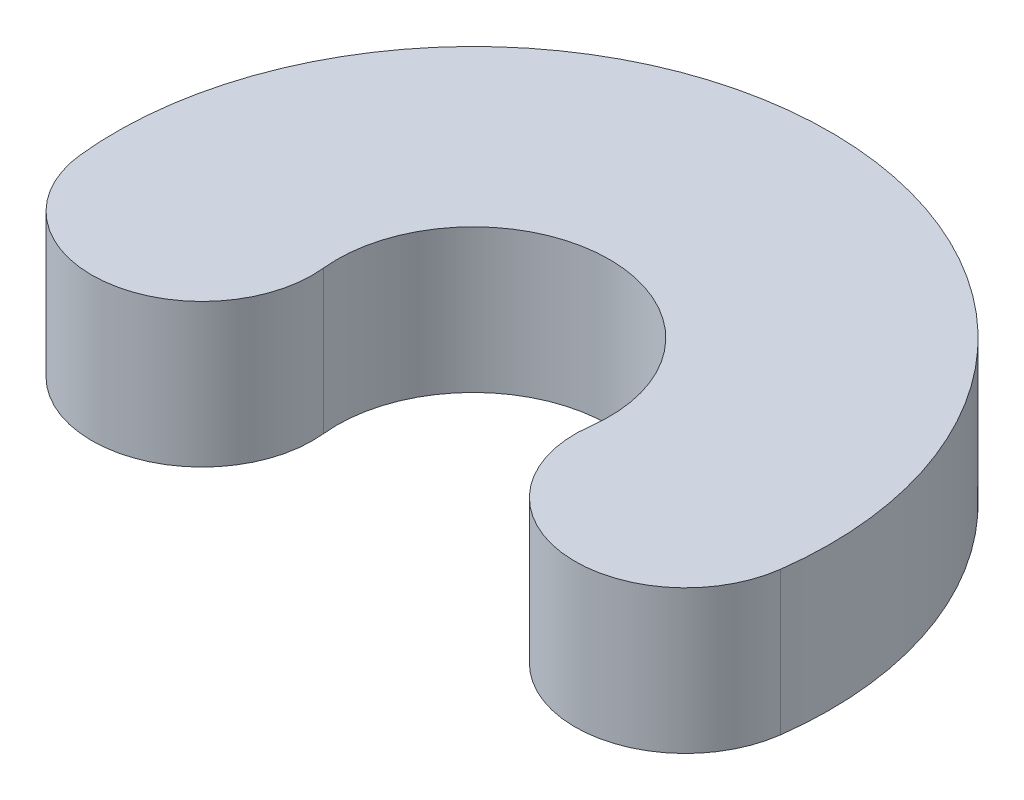
ISO-10303-21;
HEADER;
FILE_DESCRIPTION(('STEP AP214'),'2;1');
FILE_NAME('part.step','',(''),(''),'','','');
FILE_SCHEMA(('AUTOMOTIVE_DESIGN { 1 0 10303 214 1 1 1 1 }'));
ENDSEC;
DATA;
#1=APPLICATION_CONTEXT('core data for automotive mechanical design processes');
#2=APPLICATION_PROTOCOL_DEFINITION('international standard','automotive_design',2000,#1);
#3=PRODUCT_CONTEXT('',#1,'mechanical');
#4=PRODUCT('Part','Part','',(#3));
#5=PRODUCT_RELATED_PRODUCT_CATEGORY('part','',(#4));
#6=PRODUCT_DEFINITION_FORMATION('','',#4);
#7=PRODUCT_DEFINITION_CONTEXT('part definition',#1,'design');
#8=PRODUCT_DEFINITION('design','',#6,#7);
#9=PRODUCT_DEFINITION_SHAPE('','',#8);
#10=(LENGTH_UNIT() NAMED_UNIT(*) SI_UNIT(.MILLI.,.METRE.));
#11=(NAMED_UNIT(*) PLANE_ANGLE_UNIT() SI_UNIT($,.RADIAN.));
#12=(NAMED_UNIT(*) SI_UNIT($,.STERADIAN.) SOLID_ANGLE_UNIT());
#13=UNCERTAINTY_MEASURE_WITH_UNIT(LENGTH_MEASURE(1.E-05),#10,'distance_accuracy_value','');
#14=(GEOMETRIC_REPRESENTATION_CONTEXT(3) GLOBAL_UNCERTAINTY_ASSIGNED_CONTEXT((#13)) GLOBAL_UNIT_ASSIGNED_CONTEXT((#10,
#11,#12)) REPRESENTATION_CONTEXT('',''));
#15=CARTESIAN_POINT('',(0.,0.,0.));
#16=DIRECTION('',(0.,0.,1.));
#17=DIRECTION('',(1.,0.,0.));
#18=AXIS2_PLACEMENT_3D('',#15,#16,#17);
#19=CARTESIAN_POINT('',(56.2372597438321,33.,7.40677828719636));
#20=DIRECTION('',(0.,-1.,0.));
#21=DIRECTION('',(0.,0.,-1.));
#22=AXIS2_PLACEMENT_3D('',#19,#20,#21);
#23=CYLINDRICAL_SURFACE('',#22,25.4);
#24=CARTESIAN_POINT('',(56.2372597438321,0.,7.40677828719636));
#25=DIRECTION('',(0.,1.,0.));
#26=DIRECTION('',(0.,0.,1.));
#27=AXIS2_PLACEMENT_3D('',#24,#25,#26);
#28=CIRCLE('',#27,25.4);
#29=CARTESIAN_POINT('',(31.0547342945488,0.,4.09009138665836));
#30=VERTEX_POINT('',#29);
#31=CARTESIAN_POINT('',(81.4197851931153,0.,10.7234651877344));
#32=VERTEX_POINT('',#31);
#33=EDGE_CURVE('E143',#30,#32,#28,.T.);
#34=ORIENTED_EDGE('',*,*,#33,.T.);
#35=DIRECTION('',(0.,-1.,0.));
#36=VECTOR('',#35,1.);
#37=CARTESIAN_POINT('',(81.4197851931153,33.,10.7234651877344));
#38=LINE('',#37,#36);
#39=CARTESIAN_POINT('',(81.4197851931153,33.,10.7234651877344));
#40=VERTEX_POINT('',#39);
#41=EDGE_CURVE('E11',#40,#32,#38,.T.);
#42=ORIENTED_EDGE('',*,*,#41,.F.);
#43=CARTESIAN_POINT('',(56.2372597438321,33.,7.40677828719636));
#44=DIRECTION('',(0.,1.,0.));
#45=DIRECTION('',(0.,0.,1.));
#46=AXIS2_PLACEMENT_3D('',#43,#44,#45);
#47=CIRCLE('',#46,25.4);
#48=CARTESIAN_POINT('',(31.0547342945488,33.,4.09009138665836));
#49=VERTEX_POINT('',#48);
#50=EDGE_CURVE('E173',#49,#40,#47,.T.);
#51=ORIENTED_EDGE('',*,*,#50,.F.);
#52=DIRECTION('',(0.,-1.,0.));
#53=VECTOR('',#52,1.);
#54=CARTESIAN_POINT('',(31.0547342945488,33.,4.09009138665836));
#55=LINE('',#54,#53);
#56=EDGE_CURVE('E182',#49,#30,#55,.T.);
#57=ORIENTED_EDGE('',*,*,#56,.T.);
#58=EDGE_LOOP('',(#34,#42,#51,#57));
#59=FACE_BOUND('',#58,.T.);
#60=ADVANCED_FACE('F43',(#59),#23,.T.);
#61=CARTESIAN_POINT('',(0.,33.,0.));
#62=DIRECTION('',(0.,-1.,0.));
#63=DIRECTION('',(0.,0.,-1.));
#64=AXIS2_PLACEMENT_3D('',#61,#62,#63);
#65=CYLINDRICAL_SURFACE('',#64,82.1229208353283);
#66=CARTESIAN_POINT('',(0.,0.,0.));
#67=DIRECTION('',(0.,1.,0.));
#68=DIRECTION('',(0.,0.,1.));
#69=AXIS2_PLACEMENT_3D('',#66,#67,#68);
#70=CIRCLE('',#69,82.1229208353283);
#71=CARTESIAN_POINT('',(-81.6700361672202,0.,8.61274166398485));
#72=VERTEX_POINT('',#71);
#73=EDGE_CURVE('E149',#32,#72,#70,.T.);
#74=ORIENTED_EDGE('',*,*,#73,.T.);
#75=DIRECTION('',(0.,-1.,0.));
#76=VECTOR('',#75,1.);
#77=CARTESIAN_POINT('',(-81.6700361672202,33.,8.61274166398485));
#78=LINE('',#77,#76);
#79=CARTESIAN_POINT('',(-81.6700361672202,33.,8.61274166398485));
#80=VERTEX_POINT('',#79);
#81=EDGE_CURVE('E51',#80,#72,#78,.T.);
#82=ORIENTED_EDGE('',*,*,#81,.F.);
#83=CARTESIAN_POINT('',(0.,33.,0.));
#84=DIRECTION('',(0.,1.,0.));
#85=DIRECTION('',(0.,0.,1.));
#86=AXIS2_PLACEMENT_3D('',#83,#84,#85);
#87=CIRCLE('',#86,82.1229208353283);
#88=EDGE_CURVE('E95',#40,#80,#87,.T.);
#89=ORIENTED_EDGE('',*,*,#88,.F.);
#90=ORIENTED_EDGE('',*,*,#41,.T.);
#91=EDGE_LOOP('',(#74,#82,#89,#90));
#92=FACE_BOUND('',#91,.T.);
#93=ADVANCED_FACE('F217',(#92),#65,.T.);
#94=CARTESIAN_POINT('',(-56.4101099791711,33.,5.94888562915292));
#95=DIRECTION('',(0.,-1.,0.));
#96=DIRECTION('',(0.,0.,-1.));
#97=AXIS2_PLACEMENT_3D('',#94,#95,#96);
#98=CYLINDRICAL_SURFACE('',#97,25.4);
#99=CARTESIAN_POINT('',(-56.4101099791711,0.,5.94888562915292));
#100=DIRECTION('',(0.,1.,0.));
#101=DIRECTION('',(0.,0.,1.));
#102=AXIS2_PLACEMENT_3D('',#99,#100,#101);
#103=CIRCLE('',#102,25.4);
#104=CARTESIAN_POINT('',(-31.150183791122,0.,3.28502959432098));
#105=VERTEX_POINT('',#104);
#106=EDGE_CURVE('E186',#72,#105,#103,.T.);
#107=ORIENTED_EDGE('',*,*,#106,.T.);
#108=DIRECTION('',(0.,-1.,0.));
#109=VECTOR('',#108,1.);
#110=CARTESIAN_POINT('',(-31.150183791122,33.,3.28502959432098));
#111=LINE('',#110,#109);
#112=CARTESIAN_POINT('',(-31.150183791122,33.,3.28502959432098));
#113=VERTEX_POINT('',#112);
#114=EDGE_CURVE('E193',#113,#105,#111,.T.);
#115=ORIENTED_EDGE('',*,*,#114,.F.);
#116=CARTESIAN_POINT('',(-56.4101099791711,33.,5.94888562915292));
#117=DIRECTION('',(0.,1.,0.));
#118=DIRECTION('',(0.,0.,1.));
#119=AXIS2_PLACEMENT_3D('',#116,#117,#118);
#120=CIRCLE('',#119,25.4);
#121=EDGE_CURVE('E178',#80,#113,#120,.T.);
#122=ORIENTED_EDGE('',*,*,#121,.F.);
#123=ORIENTED_EDGE('',*,*,#81,.T.);
#124=EDGE_LOOP('',(#107,#115,#122,#123));
#125=FACE_BOUND('',#124,.T.);
#126=ADVANCED_FACE('F200',(#125),#98,.T.);
#127=CARTESIAN_POINT('',(0.,33.,0.));
#128=DIRECTION('',(0.,-1.,0.));
#129=DIRECTION('',(0.,0.,-1.));
#130=AXIS2_PLACEMENT_3D('',#127,#128,#129);
#131=CYLINDRICAL_SURFACE('',#130,31.3229208353283);
#132=CARTESIAN_POINT('',(0.,0.,0.));
#133=DIRECTION('',(0.,-1.,0.));
#134=DIRECTION('',(0.,0.,1.));
#135=AXIS2_PLACEMENT_3D('',#132,#133,#134);
#136=CIRCLE('',#135,31.3229208353283);
#137=EDGE_CURVE('E88',#105,#30,#136,.T.);
#138=ORIENTED_EDGE('',*,*,#137,.T.);
#139=ORIENTED_EDGE('',*,*,#56,.F.);
#140=CARTESIAN_POINT('',(0.,33.,0.));
#141=DIRECTION('',(0.,-1.,0.));
#142=DIRECTION('',(0.,0.,1.));
#143=AXIS2_PLACEMENT_3D('',#140,#141,#142);
#144=CIRCLE('',#143,31.3229208353283);
#145=EDGE_CURVE('E67',#113,#49,#144,.T.);
#146=ORIENTED_EDGE('',*,*,#145,.F.);
#147=ORIENTED_EDGE('',*,*,#114,.T.);
#148=EDGE_LOOP('',(#138,#139,#146,#147));
#149=FACE_BOUND('',#148,.T.);
#150=ADVANCED_FACE('F208',(#149),#131,.F.);
#151=CARTESIAN_POINT('',(28.118629871916,33.,3.70338914359818));
#152=DIRECTION('',(0.,1.,0.));
#153=DIRECTION('',(0.,0.,1.));
#154=AXIS2_PLACEMENT_3D('',#151,#152,#153);
#155=PLANE('',#154);
#156=ORIENTED_EDGE('',*,*,#50,.T.);
#157=ORIENTED_EDGE('',*,*,#88,.T.);
#158=ORIENTED_EDGE('',*,*,#121,.T.);
#159=ORIENTED_EDGE('',*,*,#145,.T.);
#160=EDGE_LOOP('',(#156,#157,#158,#159));
#161=FACE_BOUND('',#160,.T.);
#162=ADVANCED_FACE('F210',(#161),#155,.T.);
#163=CARTESIAN_POINT('',(28.118629871916,0.,3.70338914359818));
#164=DIRECTION('',(0.,1.,0.));
#165=DIRECTION('',(0.,0.,1.));
#166=AXIS2_PLACEMENT_3D('',#163,#164,#165);
#167=PLANE('',#166);
#168=CARTESIAN_POINT('',(0.,0.,0.));
#169=DIRECTION('',(0.,1.,0.));
#170=DIRECTION('',(0.,0.,1.));
#171=AXIS2_PLACEMENT_3D('',#168,#169,#170);
#172=CIRCLE('',#171,41.3229208353283);
#173=CARTESIAN_POINT('',(-41.0950366210626,0.,4.33379181275875));
#174=VERTEX_POINT('',#173);
#175=CARTESIAN_POINT('',(40.9691143926918,0.,5.39587363096467));
#176=VERTEX_POINT('',#175);
#177=EDGE_CURVE('E137',#174,#176,#172,.F.);
#178=ORIENTED_EDGE('',*,*,#177,.T.);
#179=CARTESIAN_POINT('',(56.2372597438321,0.,7.40677828719636));
#180=DIRECTION('',(0.,1.,0.));
#181=DIRECTION('',(0.,0.,1.));
#182=AXIS2_PLACEMENT_3D('',#179,#180,#181);
#183=CIRCLE('',#182,15.4);
#184=CARTESIAN_POINT('',(71.5054050949723,0.,9.41768294342808));
#185=VERTEX_POINT('',#184);
#186=EDGE_CURVE('E163',#176,#185,#183,.T.);
#187=ORIENTED_EDGE('',*,*,#186,.T.);
#188=CARTESIAN_POINT('',(0.,0.,0.));
#189=DIRECTION('',(0.,1.,0.));
#190=DIRECTION('',(0.,0.,1.));
#191=AXIS2_PLACEMENT_3D('',#188,#189,#190);
#192=CIRCLE('',#191,72.1229208353283);
#193=CARTESIAN_POINT('',(-71.7251833372796,0.,7.5639794455471));
#194=VERTEX_POINT('',#193);
#195=EDGE_CURVE('E141',#185,#194,#192,.T.);
#196=ORIENTED_EDGE('',*,*,#195,.T.);
#197=CARTESIAN_POINT('',(-56.4101099791711,0.,5.94888562915292));
#198=DIRECTION('',(0.,1.,0.));
#199=DIRECTION('',(0.,0.,1.));
#200=AXIS2_PLACEMENT_3D('',#197,#198,#199);
#201=CIRCLE('',#200,15.4);
#202=EDGE_CURVE('E58',#194,#174,#201,.T.);
#203=ORIENTED_EDGE('',*,*,#202,.T.);
#204=EDGE_LOOP('',(#178,#187,#196,#203));
#205=FACE_BOUND('',#204,.T.);
#206=ORIENTED_EDGE('',*,*,#33,.F.);
#207=ORIENTED_EDGE('',*,*,#137,.F.);
#208=ORIENTED_EDGE('',*,*,#106,.F.);
#209=ORIENTED_EDGE('',*,*,#73,.F.);
#210=EDGE_LOOP('',(#206,#207,#208,#209));
#211=FACE_BOUND('',#210,.T.);
#212=ADVANCED_FACE('F204',(#205,#211),#167,.F.);
#213=CARTESIAN_POINT('',(56.2372597438321,33.,7.40677828719636));
#214=DIRECTION('',(0.,-1.,0.));
#215=DIRECTION('',(0.,0.,-1.));
#216=AXIS2_PLACEMENT_3D('',#213,#214,#215);
#217=CYLINDRICAL_SURFACE('',#216,15.4);
#218=ORIENTED_EDGE('',*,*,#186,.F.);
#219=DIRECTION('',(0.,-1.,0.));
#220=VECTOR('',#219,1.);
#221=CARTESIAN_POINT('',(40.9691143926918,33.,5.39587363096467));
#222=LINE('',#221,#220);
#223=CARTESIAN_POINT('',(40.9691143926918,23.,5.39587363096467));
#224=VERTEX_POINT('',#223);
#225=EDGE_CURVE('E135',#224,#176,#222,.T.);
#226=ORIENTED_EDGE('',*,*,#225,.F.);
#227=CARTESIAN_POINT('',(56.2372597438321,23.,7.40677828719636));
#228=DIRECTION('',(0.,1.,0.));
#229=DIRECTION('',(0.,0.,1.));
#230=AXIS2_PLACEMENT_3D('',#227,#228,#229);
#231=CIRCLE('',#230,15.4);
#232=CARTESIAN_POINT('',(71.5054050949723,23.,9.41768294342808));
#233=VERTEX_POINT('',#232);
#234=EDGE_CURVE('E122',#224,#233,#231,.T.);
#235=ORIENTED_EDGE('',*,*,#234,.T.);
#236=DIRECTION('',(0.,-1.,0.));
#237=VECTOR('',#236,1.);
#238=CARTESIAN_POINT('',(71.5054050949723,33.,9.41768294342808));
#239=LINE('',#238,#237);
#240=EDGE_CURVE('E133',#233,#185,#239,.T.);
#241=ORIENTED_EDGE('',*,*,#240,.T.);
#242=EDGE_LOOP('',(#218,#226,#235,#241));
#243=FACE_BOUND('',#242,.T.);
#244=ADVANCED_FACE('F132',(#243),#217,.F.);
#245=CARTESIAN_POINT('',(0.,33.,0.));
#246=DIRECTION('',(0.,-1.,0.));
#247=DIRECTION('',(0.,0.,-1.));
#248=AXIS2_PLACEMENT_3D('',#245,#246,#247);
#249=CYLINDRICAL_SURFACE('',#248,72.1229208353283);
#250=ORIENTED_EDGE('',*,*,#195,.F.);
#251=ORIENTED_EDGE('',*,*,#240,.F.);
#252=CARTESIAN_POINT('',(0.,23.,0.));
#253=DIRECTION('',(0.,1.,0.));
#254=DIRECTION('',(0.,0.,1.));
#255=AXIS2_PLACEMENT_3D('',#252,#253,#254);
#256=CIRCLE('',#255,72.1229208353283);
#257=CARTESIAN_POINT('',(-71.7251833372796,23.,7.56397944554708));
#258=VERTEX_POINT('',#257);
#259=EDGE_CURVE('E118',#233,#258,#256,.T.);
#260=ORIENTED_EDGE('',*,*,#259,.T.);
#261=DIRECTION('',(0.,-1.,0.));
#262=VECTOR('',#261,1.);
#263=CARTESIAN_POINT('',(-71.7251833372796,33.,7.56397944554708));
#264=LINE('',#263,#262);
#265=EDGE_CURVE('E144',#258,#194,#264,.T.);
#266=ORIENTED_EDGE('',*,*,#265,.T.);
#267=EDGE_LOOP('',(#250,#251,#260,#266));
#268=FACE_BOUND('',#267,.T.);
#269=ADVANCED_FACE('F139',(#268),#249,.F.);
#270=CARTESIAN_POINT('',(-56.4101099791711,33.,5.94888562915292));
#271=DIRECTION('',(0.,-1.,0.));
#272=DIRECTION('',(0.,0.,-1.));
#273=AXIS2_PLACEMENT_3D('',#270,#271,#272);
#274=CYLINDRICAL_SURFACE('',#273,15.4);
#275=ORIENTED_EDGE('',*,*,#202,.F.);
#276=ORIENTED_EDGE('',*,*,#265,.F.);
#277=CARTESIAN_POINT('',(-56.4101099791711,23.,5.94888562915292));
#278=DIRECTION('',(0.,1.,0.));
#279=DIRECTION('',(0.,0.,1.));
#280=AXIS2_PLACEMENT_3D('',#277,#278,#279);
#281=CIRCLE('',#280,15.4);
#282=CARTESIAN_POINT('',(-41.0950366210626,23.,4.33379181275875));
#283=VERTEX_POINT('',#282);
#284=EDGE_CURVE('E123',#258,#283,#281,.T.);
#285=ORIENTED_EDGE('',*,*,#284,.T.);
#286=DIRECTION('',(0.,-1.,0.));
#287=VECTOR('',#286,1.);
#288=CARTESIAN_POINT('',(-41.0950366210626,33.,4.33379181275875));
#289=LINE('',#288,#287);
#290=EDGE_CURVE('E151',#283,#174,#289,.T.);
#291=ORIENTED_EDGE('',*,*,#290,.T.);
#292=EDGE_LOOP('',(#275,#276,#285,#291));
#293=FACE_BOUND('',#292,.T.);
#294=ADVANCED_FACE('F261',(#293),#274,.F.);
#295=CARTESIAN_POINT('',(0.,33.,0.));
#296=DIRECTION('',(0.,-1.,0.));
#297=DIRECTION('',(0.,0.,-1.));
#298=AXIS2_PLACEMENT_3D('',#295,#296,#297);
#299=CYLINDRICAL_SURFACE('',#298,41.3229208353283);
#300=ORIENTED_EDGE('',*,*,#177,.F.);
#301=ORIENTED_EDGE('',*,*,#290,.F.);
#302=CARTESIAN_POINT('',(0.,23.,0.));
#303=DIRECTION('',(0.,1.,0.));
#304=DIRECTION('',(0.,0.,1.));
#305=AXIS2_PLACEMENT_3D('',#302,#303,#304);
#306=CIRCLE('',#305,41.3229208353283);
#307=EDGE_CURVE('E155',#283,#224,#306,.F.);
#308=ORIENTED_EDGE('',*,*,#307,.T.);
#309=ORIENTED_EDGE('',*,*,#225,.T.);
#310=EDGE_LOOP('',(#300,#301,#308,#309));
#311=FACE_BOUND('',#310,.T.);
#312=ADVANCED_FACE('F269',(#311),#299,.T.);
#313=CARTESIAN_POINT('',(28.118629871916,23.,3.70338914359818));
#314=DIRECTION('',(0.,1.,0.));
#315=DIRECTION('',(0.,0.,1.));
#316=AXIS2_PLACEMENT_3D('',#313,#314,#315);
#317=PLANE('',#316);
#318=ORIENTED_EDGE('',*,*,#234,.F.);
#319=ORIENTED_EDGE('',*,*,#307,.F.);
#320=ORIENTED_EDGE('',*,*,#284,.F.);
#321=ORIENTED_EDGE('',*,*,#259,.F.);
#322=EDGE_LOOP('',(#318,#319,#320,#321));
#323=FACE_BOUND('',#322,.T.);
#324=ADVANCED_FACE('F120',(#323),#317,.F.);
#325=CLOSED_SHELL('',(#60,#93,#126,#150,#162,#212,#244,#269,#294,#312,#324));
#326=MANIFOLD_SOLID_BREP('B2',#325);
#327=ADVANCED_BREP_SHAPE_REPRESENTATION('',(#18,#326),#14);
#328=SHAPE_DEFINITION_REPRESENTATION(#9,#327);
ENDSEC;
END-ISO-10303-21;
